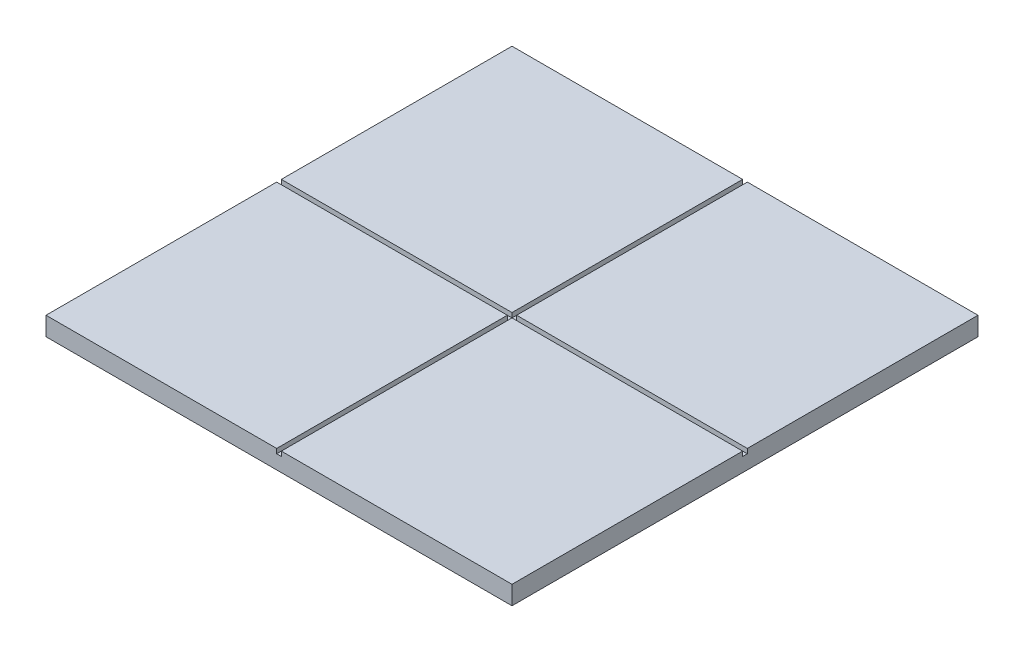
ISO-10303-21;
HEADER;
FILE_DESCRIPTION(('STEP AP214'),'2;1');
FILE_NAME('part.step','',(''),(''),'','','');
FILE_SCHEMA(('AUTOMOTIVE_DESIGN { 1 0 10303 214 1 1 1 1 }'));
ENDSEC;
DATA;
#1=APPLICATION_CONTEXT('core data for automotive mechanical design processes');
#2=APPLICATION_PROTOCOL_DEFINITION('international standard','automotive_design',2000,#1);
#3=PRODUCT_CONTEXT('',#1,'mechanical');
#4=PRODUCT('Part','Part','',(#3));
#5=PRODUCT_RELATED_PRODUCT_CATEGORY('part','',(#4));
#6=PRODUCT_DEFINITION_FORMATION('','',#4);
#7=PRODUCT_DEFINITION_CONTEXT('part definition',#1,'design');
#8=PRODUCT_DEFINITION('design','',#6,#7);
#9=PRODUCT_DEFINITION_SHAPE('','',#8);
#10=(LENGTH_UNIT() NAMED_UNIT(*) SI_UNIT(.MILLI.,.METRE.));
#11=(NAMED_UNIT(*) PLANE_ANGLE_UNIT() SI_UNIT($,.RADIAN.));
#12=(NAMED_UNIT(*) SI_UNIT($,.STERADIAN.) SOLID_ANGLE_UNIT());
#13=UNCERTAINTY_MEASURE_WITH_UNIT(LENGTH_MEASURE(1.E-05),#10,'distance_accuracy_value','');
#14=(GEOMETRIC_REPRESENTATION_CONTEXT(3) GLOBAL_UNCERTAINTY_ASSIGNED_CONTEXT((#13)) GLOBAL_UNIT_ASSIGNED_CONTEXT((#10,
#11,#12)) REPRESENTATION_CONTEXT('',''));
#15=CARTESIAN_POINT('',(0.,0.,0.));
#16=DIRECTION('',(0.,0.,1.));
#17=DIRECTION('',(1.,0.,0.));
#18=AXIS2_PLACEMENT_3D('',#15,#16,#17);
#19=CARTESIAN_POINT('',(0.,2.,0.));
#20=DIRECTION('',(0.,0.,-1.));
#21=DIRECTION('',(-1.,0.,0.));
#22=AXIS2_PLACEMENT_3D('',#19,#20,#21);
#23=PLANE('',#22);
#24=DIRECTION('',(0.,1.,0.));
#25=VECTOR('',#24,1.);
#26=CARTESIAN_POINT('',(25.25,1.5,0.));
#27=LINE('',#26,#25);
#28=CARTESIAN_POINT('',(25.25,1.5,0.));
#29=VERTEX_POINT('',#28);
#30=CARTESIAN_POINT('',(25.25,2.,0.));
#31=VERTEX_POINT('',#30);
#32=EDGE_CURVE('E249',#29,#31,#27,.T.);
#33=ORIENTED_EDGE('',*,*,#32,.F.);
#34=DIRECTION('',(1.,0.,0.));
#35=VECTOR('',#34,1.);
#36=CARTESIAN_POINT('',(24.75,1.5,0.));
#37=LINE('',#36,#35);
#38=CARTESIAN_POINT('',(24.75,1.5,0.));
#39=VERTEX_POINT('',#38);
#40=EDGE_CURVE('E234',#39,#29,#37,.T.);
#41=ORIENTED_EDGE('',*,*,#40,.F.);
#42=DIRECTION('',(0.,1.,0.));
#43=VECTOR('',#42,1.);
#44=CARTESIAN_POINT('',(24.75,1.5,0.));
#45=LINE('',#44,#43);
#46=CARTESIAN_POINT('',(24.75,2.,0.));
#47=VERTEX_POINT('',#46);
#48=EDGE_CURVE('E246',#39,#47,#45,.T.);
#49=ORIENTED_EDGE('',*,*,#48,.T.);
#50=DIRECTION('',(1.,0.,0.));
#51=VECTOR('',#50,1.);
#52=CARTESIAN_POINT('',(0.,2.,0.));
#53=LINE('',#52,#51);
#54=CARTESIAN_POINT('',(0.,2.,0.));
#55=VERTEX_POINT('',#54);
#56=EDGE_CURVE('E265',#55,#47,#53,.T.);
#57=ORIENTED_EDGE('',*,*,#56,.F.);
#58=DIRECTION('',(0.,-1.,0.));
#59=VECTOR('',#58,1.);
#60=CARTESIAN_POINT('',(0.,2.,0.));
#61=LINE('',#60,#59);
#62=CARTESIAN_POINT('',(0.,0.,0.));
#63=VERTEX_POINT('',#62);
#64=EDGE_CURVE('E12',#55,#63,#61,.T.);
#65=ORIENTED_EDGE('',*,*,#64,.T.);
#66=DIRECTION('',(1.,0.,0.));
#67=VECTOR('',#66,1.);
#68=CARTESIAN_POINT('',(0.,0.,0.));
#69=LINE('',#68,#67);
#70=CARTESIAN_POINT('',(50.,0.,0.));
#71=VERTEX_POINT('',#70);
#72=EDGE_CURVE('E277',#63,#71,#69,.T.);
#73=ORIENTED_EDGE('',*,*,#72,.T.);
#74=DIRECTION('',(0.,-1.,0.));
#75=VECTOR('',#74,1.);
#76=CARTESIAN_POINT('',(50.,2.,0.));
#77=LINE('',#76,#75);
#78=CARTESIAN_POINT('',(50.,2.,0.));
#79=VERTEX_POINT('',#78);
#80=EDGE_CURVE('E65',#79,#71,#77,.T.);
#81=ORIENTED_EDGE('',*,*,#80,.F.);
#82=EDGE_CURVE('E264',#31,#79,#53,.T.);
#83=ORIENTED_EDGE('',*,*,#82,.F.);
#84=EDGE_LOOP('',(#33,#41,#49,#57,#65,#73,#81,#83));
#85=FACE_BOUND('',#84,.T.);
#86=ADVANCED_FACE('F57',(#85),#23,.F.);
#87=CARTESIAN_POINT('',(0.,2.,-50.));
#88=DIRECTION('',(0.,0.,1.));
#89=DIRECTION('',(1.,0.,0.));
#90=AXIS2_PLACEMENT_3D('',#87,#88,#89);
#91=PLANE('',#90);
#92=DIRECTION('',(0.,1.,0.));
#93=VECTOR('',#92,1.);
#94=CARTESIAN_POINT('',(25.25,1.5,-50.));
#95=LINE('',#94,#93);
#96=CARTESIAN_POINT('',(25.25,1.5,-50.));
#97=VERTEX_POINT('',#96);
#98=CARTESIAN_POINT('',(25.25,2.,-50.));
#99=VERTEX_POINT('',#98);
#100=EDGE_CURVE('E251',#97,#99,#95,.T.);
#101=ORIENTED_EDGE('',*,*,#100,.T.);
#102=DIRECTION('',(-1.,0.,0.));
#103=VECTOR('',#102,1.);
#104=CARTESIAN_POINT('',(0.,2.,-50.));
#105=LINE('',#104,#103);
#106=CARTESIAN_POINT('',(50.,2.,-50.));
#107=VERTEX_POINT('',#106);
#108=EDGE_CURVE('E271',#107,#99,#105,.T.);
#109=ORIENTED_EDGE('',*,*,#108,.F.);
#110=DIRECTION('',(0.,-1.,0.));
#111=VECTOR('',#110,1.);
#112=CARTESIAN_POINT('',(50.,2.,-50.));
#113=LINE('',#112,#111);
#114=CARTESIAN_POINT('',(50.,0.,-50.));
#115=VERTEX_POINT('',#114);
#116=EDGE_CURVE('E283',#107,#115,#113,.T.);
#117=ORIENTED_EDGE('',*,*,#116,.T.);
#118=DIRECTION('',(-1.,0.,0.));
#119=VECTOR('',#118,1.);
#120=CARTESIAN_POINT('',(0.,0.,-50.));
#121=LINE('',#120,#119);
#122=CARTESIAN_POINT('',(0.,0.,-50.));
#123=VERTEX_POINT('',#122);
#124=EDGE_CURVE('E102',#115,#123,#121,.T.);
#125=ORIENTED_EDGE('',*,*,#124,.T.);
#126=DIRECTION('',(0.,-1.,0.));
#127=VECTOR('',#126,1.);
#128=CARTESIAN_POINT('',(0.,2.,-50.));
#129=LINE('',#128,#127);
#130=CARTESIAN_POINT('',(0.,2.,-50.));
#131=VERTEX_POINT('',#130);
#132=EDGE_CURVE('E274',#131,#123,#129,.T.);
#133=ORIENTED_EDGE('',*,*,#132,.F.);
#134=CARTESIAN_POINT('',(24.75,2.,-50.));
#135=VERTEX_POINT('',#134);
#136=EDGE_CURVE('E80',#135,#131,#105,.T.);
#137=ORIENTED_EDGE('',*,*,#136,.F.);
#138=DIRECTION('',(0.,1.,0.));
#139=VECTOR('',#138,1.);
#140=CARTESIAN_POINT('',(24.75,1.5,-50.));
#141=LINE('',#140,#139);
#142=CARTESIAN_POINT('',(24.75,1.5,-50.));
#143=VERTEX_POINT('',#142);
#144=EDGE_CURVE('E72',#143,#135,#141,.T.);
#145=ORIENTED_EDGE('',*,*,#144,.F.);
#146=DIRECTION('',(1.,0.,0.));
#147=VECTOR('',#146,1.);
#148=CARTESIAN_POINT('',(24.75,1.5,-50.));
#149=LINE('',#148,#147);
#150=EDGE_CURVE('E226',#143,#97,#149,.T.);
#151=ORIENTED_EDGE('',*,*,#150,.T.);
#152=EDGE_LOOP('',(#101,#109,#117,#125,#133,#137,#145,#151));
#153=FACE_BOUND('',#152,.T.);
#154=ADVANCED_FACE('F298',(#153),#91,.F.);
#155=CARTESIAN_POINT('',(0.,2.,0.));
#156=DIRECTION('',(0.,-1.,0.));
#157=DIRECTION('',(0.,0.,-1.));
#158=AXIS2_PLACEMENT_3D('',#155,#156,#157);
#159=PLANE('',#158);
#160=DIRECTION('',(0.,0.,-1.));
#161=VECTOR('',#160,1.);
#162=CARTESIAN_POINT('',(50.,2.,0.));
#163=LINE('',#162,#161);
#164=CARTESIAN_POINT('',(50.,2.,-24.75));
#165=VERTEX_POINT('',#164);
#166=EDGE_CURVE('E268',#79,#165,#163,.T.);
#167=ORIENTED_EDGE('',*,*,#166,.T.);
#168=DIRECTION('',(1.,0.,0.));
#169=VECTOR('',#168,1.);
#170=CARTESIAN_POINT('',(0.,2.,-24.75));
#171=LINE('',#170,#169);
#172=CARTESIAN_POINT('',(25.25,2.,-24.75));
#173=VERTEX_POINT('',#172);
#174=EDGE_CURVE('E214',#173,#165,#171,.T.);
#175=ORIENTED_EDGE('',*,*,#174,.F.);
#176=DIRECTION('',(0.,0.,1.));
#177=VECTOR('',#176,1.);
#178=CARTESIAN_POINT('',(25.25,2.,-50.));
#179=LINE('',#178,#177);
#180=EDGE_CURVE('E243',#173,#31,#179,.T.);
#181=ORIENTED_EDGE('',*,*,#180,.T.);
#182=ORIENTED_EDGE('',*,*,#82,.T.);
#183=EDGE_LOOP('',(#167,#175,#181,#182));
#184=FACE_BOUND('',#183,.T.);
#185=ADVANCED_FACE('F312',(#184),#159,.F.);
#186=DIRECTION('',(1.,0.,0.));
#187=VECTOR('',#186,1.);
#188=CARTESIAN_POINT('',(0.,2.,-25.25));
#189=LINE('',#188,#187);
#190=CARTESIAN_POINT('',(25.25,2.,-25.25));
#191=VERTEX_POINT('',#190);
#192=CARTESIAN_POINT('',(50.,2.,-25.25));
#193=VERTEX_POINT('',#192);
#194=EDGE_CURVE('E215',#191,#193,#189,.T.);
#195=ORIENTED_EDGE('',*,*,#194,.T.);
#196=EDGE_CURVE('E267',#193,#107,#163,.T.);
#197=ORIENTED_EDGE('',*,*,#196,.T.);
#198=ORIENTED_EDGE('',*,*,#108,.T.);
#199=EDGE_CURVE('E239',#99,#191,#179,.T.);
#200=ORIENTED_EDGE('',*,*,#199,.T.);
#201=EDGE_LOOP('',(#195,#197,#198,#200));
#202=FACE_BOUND('',#201,.T.);
#203=ADVANCED_FACE('F305',(#202),#159,.F.);
#204=CARTESIAN_POINT('',(0.,2.,-25.25));
#205=VERTEX_POINT('',#204);
#206=CARTESIAN_POINT('',(24.75,2.,-25.25));
#207=VERTEX_POINT('',#206);
#208=EDGE_CURVE('E189',#205,#207,#189,.T.);
#209=ORIENTED_EDGE('',*,*,#208,.T.);
#210=DIRECTION('',(0.,0.,1.));
#211=VECTOR('',#210,1.);
#212=CARTESIAN_POINT('',(24.75,2.,-50.));
#213=LINE('',#212,#211);
#214=EDGE_CURVE('E230',#135,#207,#213,.T.);
#215=ORIENTED_EDGE('',*,*,#214,.F.);
#216=ORIENTED_EDGE('',*,*,#136,.T.);
#217=DIRECTION('',(0.,0.,1.));
#218=VECTOR('',#217,1.);
#219=CARTESIAN_POINT('',(0.,2.,0.));
#220=LINE('',#219,#218);
#221=EDGE_CURVE('E262',#131,#205,#220,.T.);
#222=ORIENTED_EDGE('',*,*,#221,.T.);
#223=EDGE_LOOP('',(#209,#215,#216,#222));
#224=FACE_BOUND('',#223,.T.);
#225=ADVANCED_FACE('F303',(#224),#159,.F.);
#226=CARTESIAN_POINT('',(0.,2.,0.));
#227=DIRECTION('',(1.,0.,0.));
#228=DIRECTION('',(0.,0.,-1.));
#229=AXIS2_PLACEMENT_3D('',#226,#227,#228);
#230=PLANE('',#229);
#231=CARTESIAN_POINT('',(0.,2.,-24.75));
#232=VERTEX_POINT('',#231);
#233=EDGE_CURVE('E110',#232,#55,#220,.T.);
#234=ORIENTED_EDGE('',*,*,#233,.F.);
#235=DIRECTION('',(0.,1.,0.));
#236=VECTOR('',#235,1.);
#237=CARTESIAN_POINT('',(0.,1.5,-24.75));
#238=LINE('',#237,#236);
#239=CARTESIAN_POINT('',(0.,1.5,-24.75));
#240=VERTEX_POINT('',#239);
#241=EDGE_CURVE('E193',#240,#232,#238,.T.);
#242=ORIENTED_EDGE('',*,*,#241,.F.);
#243=DIRECTION('',(0.,0.,1.));
#244=VECTOR('',#243,1.);
#245=CARTESIAN_POINT('',(0.,1.5,0.));
#246=LINE('',#245,#244);
#247=CARTESIAN_POINT('',(0.,1.5,-25.25));
#248=VERTEX_POINT('',#247);
#249=EDGE_CURVE('E201',#248,#240,#246,.T.);
#250=ORIENTED_EDGE('',*,*,#249,.F.);
#251=DIRECTION('',(0.,1.,0.));
#252=VECTOR('',#251,1.);
#253=CARTESIAN_POINT('',(0.,1.5,-25.25));
#254=LINE('',#253,#252);
#255=EDGE_CURVE('E184',#248,#205,#254,.T.);
#256=ORIENTED_EDGE('',*,*,#255,.T.);
#257=ORIENTED_EDGE('',*,*,#221,.F.);
#258=ORIENTED_EDGE('',*,*,#132,.T.);
#259=DIRECTION('',(0.,0.,1.));
#260=VECTOR('',#259,1.);
#261=CARTESIAN_POINT('',(0.,0.,0.));
#262=LINE('',#261,#260);
#263=EDGE_CURVE('E261',#123,#63,#262,.T.);
#264=ORIENTED_EDGE('',*,*,#263,.T.);
#265=ORIENTED_EDGE('',*,*,#64,.F.);
#266=EDGE_LOOP('',(#234,#242,#250,#256,#257,#258,#264,#265));
#267=FACE_BOUND('',#266,.T.);
#268=ADVANCED_FACE('F59',(#267),#230,.F.);
#269=CARTESIAN_POINT('',(50.,2.,0.));
#270=DIRECTION('',(-1.,0.,0.));
#271=DIRECTION('',(0.,0.,1.));
#272=AXIS2_PLACEMENT_3D('',#269,#270,#271);
#273=PLANE('',#272);
#274=DIRECTION('',(0.,0.,-1.));
#275=VECTOR('',#274,1.);
#276=CARTESIAN_POINT('',(50.,1.5,0.));
#277=LINE('',#276,#275);
#278=CARTESIAN_POINT('',(50.,1.5,-24.75));
#279=VERTEX_POINT('',#278);
#280=CARTESIAN_POINT('',(50.,1.5,-25.25));
#281=VERTEX_POINT('',#280);
#282=EDGE_CURVE('E194',#279,#281,#277,.T.);
#283=ORIENTED_EDGE('',*,*,#282,.F.);
#284=DIRECTION('',(0.,1.,0.));
#285=VECTOR('',#284,1.);
#286=CARTESIAN_POINT('',(50.,1.5,-24.75));
#287=LINE('',#286,#285);
#288=EDGE_CURVE('E222',#279,#165,#287,.T.);
#289=ORIENTED_EDGE('',*,*,#288,.T.);
#290=ORIENTED_EDGE('',*,*,#166,.F.);
#291=ORIENTED_EDGE('',*,*,#80,.T.);
#292=DIRECTION('',(0.,0.,-1.));
#293=VECTOR('',#292,1.);
#294=CARTESIAN_POINT('',(50.,0.,0.));
#295=LINE('',#294,#293);
#296=EDGE_CURVE('E279',#71,#115,#295,.T.);
#297=ORIENTED_EDGE('',*,*,#296,.T.);
#298=ORIENTED_EDGE('',*,*,#116,.F.);
#299=ORIENTED_EDGE('',*,*,#196,.F.);
#300=DIRECTION('',(0.,1.,0.));
#301=VECTOR('',#300,1.);
#302=CARTESIAN_POINT('',(50.,1.5,-25.25));
#303=LINE('',#302,#301);
#304=EDGE_CURVE('E219',#281,#193,#303,.T.);
#305=ORIENTED_EDGE('',*,*,#304,.F.);
#306=EDGE_LOOP('',(#283,#289,#290,#291,#297,#298,#299,#305));
#307=FACE_BOUND('',#306,.T.);
#308=ADVANCED_FACE('F290',(#307),#273,.F.);
#309=CARTESIAN_POINT('',(24.75,2.,-24.75));
#310=VERTEX_POINT('',#309);
#311=EDGE_CURVE('E242',#310,#47,#213,.T.);
#312=ORIENTED_EDGE('',*,*,#311,.F.);
#313=EDGE_CURVE('E216',#232,#310,#171,.T.);
#314=ORIENTED_EDGE('',*,*,#313,.F.);
#315=ORIENTED_EDGE('',*,*,#233,.T.);
#316=ORIENTED_EDGE('',*,*,#56,.T.);
#317=EDGE_LOOP('',(#312,#314,#315,#316));
#318=FACE_BOUND('',#317,.T.);
#319=ADVANCED_FACE('F307',(#318),#159,.F.);
#320=CARTESIAN_POINT('',(0.,0.,0.));
#321=DIRECTION('',(0.,-1.,0.));
#322=DIRECTION('',(0.,0.,-1.));
#323=AXIS2_PLACEMENT_3D('',#320,#321,#322);
#324=PLANE('',#323);
#325=ORIENTED_EDGE('',*,*,#263,.F.);
#326=ORIENTED_EDGE('',*,*,#124,.F.);
#327=ORIENTED_EDGE('',*,*,#296,.F.);
#328=ORIENTED_EDGE('',*,*,#72,.F.);
#329=EDGE_LOOP('',(#325,#326,#327,#328));
#330=FACE_BOUND('',#329,.T.);
#331=ADVANCED_FACE('F296',(#330),#324,.T.);
#332=CARTESIAN_POINT('',(0.,1.5,-24.75));
#333=DIRECTION('',(0.,0.,1.));
#334=DIRECTION('',(1.,0.,0.));
#335=AXIS2_PLACEMENT_3D('',#332,#333,#334);
#336=PLANE('',#335);
#337=DIRECTION('',(0.,-1.,0.));
#338=VECTOR('',#337,1.);
#339=CARTESIAN_POINT('',(24.75,1.5,-24.75));
#340=LINE('',#339,#338);
#341=CARTESIAN_POINT('',(24.75,1.5,-24.75));
#342=VERTEX_POINT('',#341);
#343=EDGE_CURVE('E221',#310,#342,#340,.T.);
#344=ORIENTED_EDGE('',*,*,#343,.T.);
#345=DIRECTION('',(1.,0.,0.));
#346=VECTOR('',#345,1.);
#347=CARTESIAN_POINT('',(0.,1.5,-24.75));
#348=LINE('',#347,#346);
#349=EDGE_CURVE('E208',#240,#342,#348,.T.);
#350=ORIENTED_EDGE('',*,*,#349,.F.);
#351=ORIENTED_EDGE('',*,*,#241,.T.);
#352=ORIENTED_EDGE('',*,*,#313,.T.);
#353=EDGE_LOOP('',(#344,#350,#351,#352));
#354=FACE_BOUND('',#353,.T.);
#355=ADVANCED_FACE('F326',(#354),#336,.F.);
#356=CARTESIAN_POINT('',(0.,1.5,-25.25));
#357=DIRECTION('',(0.,0.,1.));
#358=DIRECTION('',(1.,0.,0.));
#359=AXIS2_PLACEMENT_3D('',#356,#357,#358);
#360=PLANE('',#359);
#361=ORIENTED_EDGE('',*,*,#208,.F.);
#362=ORIENTED_EDGE('',*,*,#255,.F.);
#363=DIRECTION('',(1.,0.,0.));
#364=VECTOR('',#363,1.);
#365=CARTESIAN_POINT('',(0.,1.5,-25.25));
#366=LINE('',#365,#364);
#367=CARTESIAN_POINT('',(24.75,1.5,-25.25));
#368=VERTEX_POINT('',#367);
#369=EDGE_CURVE('E187',#248,#368,#366,.T.);
#370=ORIENTED_EDGE('',*,*,#369,.T.);
#371=DIRECTION('',(0.,-1.,0.));
#372=VECTOR('',#371,1.);
#373=CARTESIAN_POINT('',(24.75,1.5,-25.25));
#374=LINE('',#373,#372);
#375=EDGE_CURVE('E256',#207,#368,#374,.T.);
#376=ORIENTED_EDGE('',*,*,#375,.F.);
#377=EDGE_LOOP('',(#361,#362,#370,#376));
#378=FACE_BOUND('',#377,.T.);
#379=ADVANCED_FACE('F186',(#378),#360,.T.);
#380=CARTESIAN_POINT('',(0.,1.5,0.));
#381=DIRECTION('',(0.,1.,0.));
#382=DIRECTION('',(0.,0.,1.));
#383=AXIS2_PLACEMENT_3D('',#380,#381,#382);
#384=PLANE('',#383);
#385=ORIENTED_EDGE('',*,*,#369,.F.);
#386=ORIENTED_EDGE('',*,*,#249,.T.);
#387=ORIENTED_EDGE('',*,*,#349,.T.);
#388=DIRECTION('',(0.,0.,1.));
#389=VECTOR('',#388,1.);
#390=CARTESIAN_POINT('',(24.75,1.5,-50.));
#391=LINE('',#390,#389);
#392=EDGE_CURVE('E237',#342,#39,#391,.T.);
#393=ORIENTED_EDGE('',*,*,#392,.T.);
#394=ORIENTED_EDGE('',*,*,#40,.T.);
#395=DIRECTION('',(0.,0.,1.));
#396=VECTOR('',#395,1.);
#397=CARTESIAN_POINT('',(25.25,1.5,-50.));
#398=LINE('',#397,#396);
#399=CARTESIAN_POINT('',(25.25,1.5,-24.75));
#400=VERTEX_POINT('',#399);
#401=EDGE_CURVE('E229',#400,#29,#398,.T.);
#402=ORIENTED_EDGE('',*,*,#401,.F.);
#403=EDGE_CURVE('E206',#400,#279,#348,.T.);
#404=ORIENTED_EDGE('',*,*,#403,.T.);
#405=ORIENTED_EDGE('',*,*,#282,.T.);
#406=CARTESIAN_POINT('',(25.25,1.5,-25.25));
#407=VERTEX_POINT('',#406);
#408=EDGE_CURVE('E204',#407,#281,#366,.T.);
#409=ORIENTED_EDGE('',*,*,#408,.F.);
#410=EDGE_CURVE('E231',#97,#407,#398,.T.);
#411=ORIENTED_EDGE('',*,*,#410,.F.);
#412=ORIENTED_EDGE('',*,*,#150,.F.);
#413=EDGE_CURVE('E203',#143,#368,#391,.T.);
#414=ORIENTED_EDGE('',*,*,#413,.T.);
#415=EDGE_LOOP('',(#385,#386,#387,#393,#394,#402,#404,#405,#409,#411,#412,#414));
#416=FACE_BOUND('',#415,.T.);
#417=ADVANCED_FACE('F199',(#416),#384,.T.);
#418=ORIENTED_EDGE('',*,*,#174,.T.);
#419=ORIENTED_EDGE('',*,*,#288,.F.);
#420=ORIENTED_EDGE('',*,*,#403,.F.);
#421=DIRECTION('',(0.,-1.,0.));
#422=VECTOR('',#421,1.);
#423=CARTESIAN_POINT('',(25.25,1.5,-24.75));
#424=LINE('',#423,#422);
#425=EDGE_CURVE('E255',#173,#400,#424,.T.);
#426=ORIENTED_EDGE('',*,*,#425,.F.);
#427=EDGE_LOOP('',(#418,#419,#420,#426));
#428=FACE_BOUND('',#427,.T.);
#429=ADVANCED_FACE('F332',(#428),#336,.F.);
#430=DIRECTION('',(0.,-1.,0.));
#431=VECTOR('',#430,1.);
#432=CARTESIAN_POINT('',(25.25,1.5,-25.25));
#433=LINE('',#432,#431);
#434=EDGE_CURVE('E258',#191,#407,#433,.T.);
#435=ORIENTED_EDGE('',*,*,#434,.T.);
#436=ORIENTED_EDGE('',*,*,#408,.T.);
#437=ORIENTED_EDGE('',*,*,#304,.T.);
#438=ORIENTED_EDGE('',*,*,#194,.F.);
#439=EDGE_LOOP('',(#435,#436,#437,#438));
#440=FACE_BOUND('',#439,.T.);
#441=ADVANCED_FACE('F337',(#440),#360,.T.);
#442=CARTESIAN_POINT('',(25.25,1.5,-50.));
#443=DIRECTION('',(-1.,0.,0.));
#444=DIRECTION('',(0.,0.,1.));
#445=AXIS2_PLACEMENT_3D('',#442,#443,#444);
#446=PLANE('',#445);
#447=ORIENTED_EDGE('',*,*,#425,.T.);
#448=ORIENTED_EDGE('',*,*,#401,.T.);
#449=ORIENTED_EDGE('',*,*,#32,.T.);
#450=ORIENTED_EDGE('',*,*,#180,.F.);
#451=EDGE_LOOP('',(#447,#448,#449,#450));
#452=FACE_BOUND('',#451,.T.);
#453=ADVANCED_FACE('F345',(#452),#446,.T.);
#454=CARTESIAN_POINT('',(24.75,1.5,-50.));
#455=DIRECTION('',(-1.,0.,0.));
#456=DIRECTION('',(0.,0.,1.));
#457=AXIS2_PLACEMENT_3D('',#454,#455,#456);
#458=PLANE('',#457);
#459=ORIENTED_EDGE('',*,*,#311,.T.);
#460=ORIENTED_EDGE('',*,*,#48,.F.);
#461=ORIENTED_EDGE('',*,*,#392,.F.);
#462=ORIENTED_EDGE('',*,*,#343,.F.);
#463=EDGE_LOOP('',(#459,#460,#461,#462));
#464=FACE_BOUND('',#463,.T.);
#465=ADVANCED_FACE('F360',(#464),#458,.F.);
#466=ORIENTED_EDGE('',*,*,#199,.F.);
#467=ORIENTED_EDGE('',*,*,#100,.F.);
#468=ORIENTED_EDGE('',*,*,#410,.T.);
#469=ORIENTED_EDGE('',*,*,#434,.F.);
#470=EDGE_LOOP('',(#466,#467,#468,#469));
#471=FACE_BOUND('',#470,.T.);
#472=ADVANCED_FACE('F363',(#471),#446,.T.);
#473=ORIENTED_EDGE('',*,*,#375,.T.);
#474=ORIENTED_EDGE('',*,*,#413,.F.);
#475=ORIENTED_EDGE('',*,*,#144,.T.);
#476=ORIENTED_EDGE('',*,*,#214,.T.);
#477=EDGE_LOOP('',(#473,#474,#475,#476));
#478=FACE_BOUND('',#477,.T.);
#479=ADVANCED_FACE('F302',(#478),#458,.F.);
#480=CLOSED_SHELL('',(#86,#154,#185,#203,#225,#268,#308,#319,#331,#355,#379,#417,#429,#441,#453,
#465,#472,#479));
#481=MANIFOLD_SOLID_BREP('B2',#480);
#482=ADVANCED_BREP_SHAPE_REPRESENTATION('',(#18,#481),#14);
#483=SHAPE_DEFINITION_REPRESENTATION(#9,#482);
ENDSEC;
END-ISO-10303-21;
